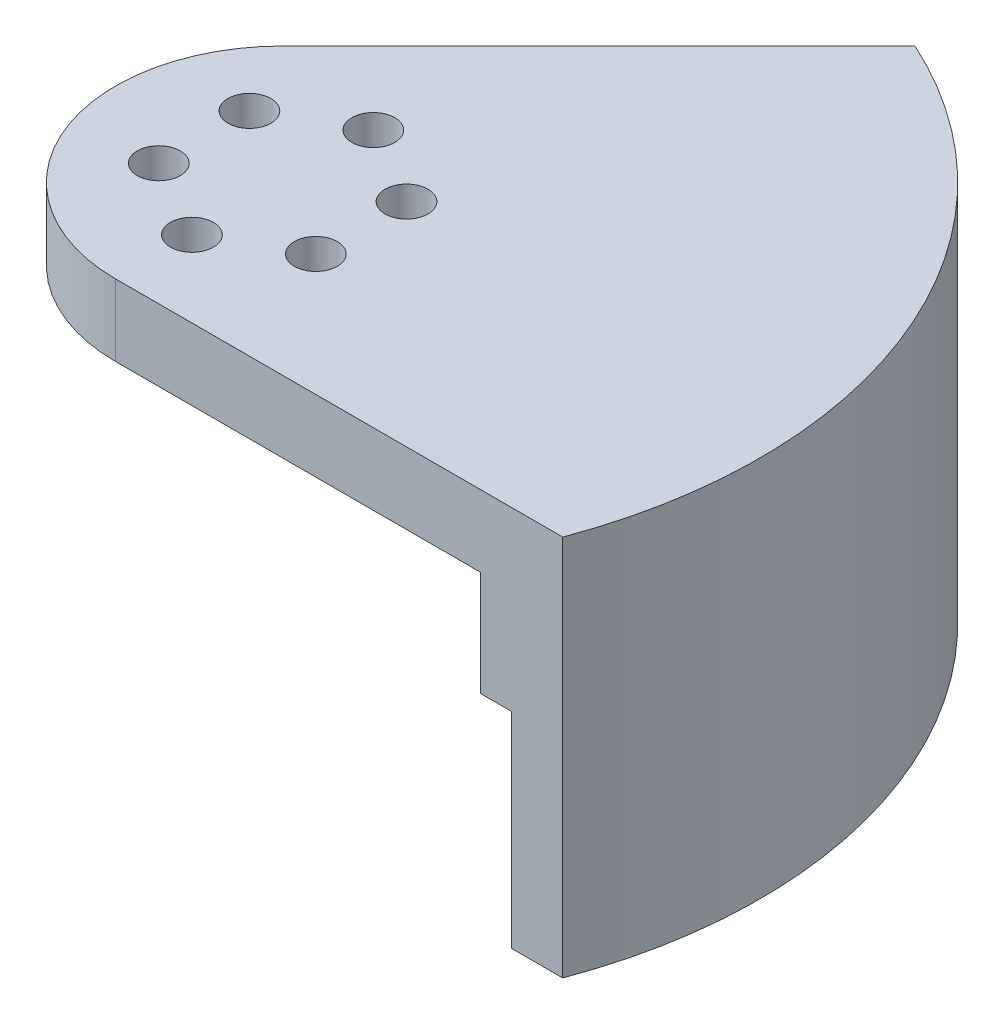
ISO-10303-21;
HEADER;
FILE_DESCRIPTION(('STEP AP214'),'2;1');
FILE_NAME('part.step','',(''),(''),'','','');
FILE_SCHEMA(('AUTOMOTIVE_DESIGN { 1 0 10303 214 1 1 1 1 }'));
ENDSEC;
DATA;
#1=APPLICATION_CONTEXT('core data for automotive mechanical design processes');
#2=APPLICATION_PROTOCOL_DEFINITION('international standard','automotive_design',2000,#1);
#3=PRODUCT_CONTEXT('',#1,'mechanical');
#4=PRODUCT('Part','Part','',(#3));
#5=PRODUCT_RELATED_PRODUCT_CATEGORY('part','',(#4));
#6=PRODUCT_DEFINITION_FORMATION('','',#4);
#7=PRODUCT_DEFINITION_CONTEXT('part definition',#1,'design');
#8=PRODUCT_DEFINITION('design','',#6,#7);
#9=PRODUCT_DEFINITION_SHAPE('','',#8);
#10=(LENGTH_UNIT() NAMED_UNIT(*) SI_UNIT(.MILLI.,.METRE.));
#11=(NAMED_UNIT(*) PLANE_ANGLE_UNIT() SI_UNIT($,.RADIAN.));
#12=(NAMED_UNIT(*) SI_UNIT($,.STERADIAN.) SOLID_ANGLE_UNIT());
#13=UNCERTAINTY_MEASURE_WITH_UNIT(LENGTH_MEASURE(1.E-05),#10,'distance_accuracy_value','');
#14=(GEOMETRIC_REPRESENTATION_CONTEXT(3) GLOBAL_UNCERTAINTY_ASSIGNED_CONTEXT((#13)) GLOBAL_UNIT_ASSIGNED_CONTEXT((#10,
#11,#12)) REPRESENTATION_CONTEXT('',''));
#15=CARTESIAN_POINT('',(0.,0.,0.));
#16=DIRECTION('',(0.,0.,1.));
#17=DIRECTION('',(1.,0.,0.));
#18=AXIS2_PLACEMENT_3D('',#15,#16,#17);
#19=CARTESIAN_POINT('',(0.,0.,0.));
#20=DIRECTION('',(0.,1.,0.));
#21=DIRECTION('',(0.,0.,1.));
#22=AXIS2_PLACEMENT_3D('',#19,#20,#21);
#23=PLANE('',#22);
#24=CARTESIAN_POINT('',(16.4544826719043,0.,-9.5));
#25=DIRECTION('',(0.,1.,0.));
#26=DIRECTION('',(0.,0.,1.));
#27=AXIS2_PLACEMENT_3D('',#24,#25,#26);
#28=CIRCLE('',#27,2.75);
#29=CARTESIAN_POINT('',(16.4544826719043,0.,-6.75));
#30=VERTEX_POINT('',#29);
#31=EDGE_CURVE('E269',#30,#30,#28,.T.);
#32=ORIENTED_EDGE('',*,*,#31,.T.);
#33=EDGE_LOOP('',(#32));
#34=FACE_BOUND('',#33,.T.);
#35=CARTESIAN_POINT('',(16.4544826719043,0.,9.5));
#36=DIRECTION('',(0.,1.,0.));
#37=DIRECTION('',(0.,0.,1.));
#38=AXIS2_PLACEMENT_3D('',#35,#36,#37);
#39=CIRCLE('',#38,2.75);
#40=CARTESIAN_POINT('',(16.4544826719043,0.,12.25));
#41=VERTEX_POINT('',#40);
#42=EDGE_CURVE('E277',#41,#41,#39,.T.);
#43=ORIENTED_EDGE('',*,*,#42,.T.);
#44=EDGE_LOOP('',(#43));
#45=FACE_BOUND('',#44,.T.);
#46=CARTESIAN_POINT('',(0.,0.,19.));
#47=DIRECTION('',(0.,1.,0.));
#48=DIRECTION('',(0.,0.,1.));
#49=AXIS2_PLACEMENT_3D('',#46,#47,#48);
#50=CIRCLE('',#49,2.75);
#51=CARTESIAN_POINT('',(0.,0.,21.75));
#52=VERTEX_POINT('',#51);
#53=EDGE_CURVE('E285',#52,#52,#50,.T.);
#54=ORIENTED_EDGE('',*,*,#53,.T.);
#55=EDGE_LOOP('',(#54));
#56=FACE_BOUND('',#55,.T.);
#57=CARTESIAN_POINT('',(-16.4544826719043,0.,9.50000000000001));
#58=DIRECTION('',(0.,1.,0.));
#59=DIRECTION('',(0.,0.,1.));
#60=AXIS2_PLACEMENT_3D('',#57,#58,#59);
#61=CIRCLE('',#60,2.75);
#62=CARTESIAN_POINT('',(-16.4544826719043,0.,12.25));
#63=VERTEX_POINT('',#62);
#64=EDGE_CURVE('E262',#63,#63,#61,.T.);
#65=ORIENTED_EDGE('',*,*,#64,.T.);
#66=EDGE_LOOP('',(#65));
#67=FACE_BOUND('',#66,.T.);
#68=CARTESIAN_POINT('',(-16.4544826719043,0.,-9.50000000000001));
#69=DIRECTION('',(0.,1.,0.));
#70=DIRECTION('',(0.,0.,1.));
#71=AXIS2_PLACEMENT_3D('',#68,#69,#70);
#72=CIRCLE('',#71,2.75);
#73=CARTESIAN_POINT('',(-16.4544826719043,0.,-6.75000000000001));
#74=VERTEX_POINT('',#73);
#75=EDGE_CURVE('E247',#74,#74,#72,.T.);
#76=ORIENTED_EDGE('',*,*,#75,.T.);
#77=EDGE_LOOP('',(#76));
#78=FACE_BOUND('',#77,.T.);
#79=CARTESIAN_POINT('',(0.,0.,-19.));
#80=DIRECTION('',(0.,1.,0.));
#81=DIRECTION('',(0.,0.,1.));
#82=AXIS2_PLACEMENT_3D('',#79,#80,#81);
#83=CIRCLE('',#82,2.75);
#84=CARTESIAN_POINT('',(0.,0.,-16.25));
#85=VERTEX_POINT('',#84);
#86=EDGE_CURVE('E248',#85,#85,#83,.T.);
#87=ORIENTED_EDGE('',*,*,#86,.T.);
#88=EDGE_LOOP('',(#87));
#89=FACE_BOUND('',#88,.T.);
#90=DIRECTION('',(-0.707106781186548,0.,-0.707106781186547));
#91=VECTOR('',#90,1.);
#92=CARTESIAN_POINT('',(34.5977022230104,0.,-73.4885751882705));
#93=LINE('',#92,#91);
#94=CARTESIAN_POINT('',(34.5977022230104,0.,-73.4885751882705));
#95=VERTEX_POINT('',#94);
#96=CARTESIAN_POINT('',(29.2944013641113,0.,-78.7918760471696));
#97=VERTEX_POINT('',#96);
#98=EDGE_CURVE('E453',#95,#97,#93,.T.);
#99=ORIENTED_EDGE('',*,*,#98,.F.);
#100=CARTESIAN_POINT('',(37.4261293477566,0.,-76.3170023130167));
#101=DIRECTION('',(0.,-1.,0.));
#102=DIRECTION('',(0.,0.,-1.));
#103=AXIS2_PLACEMENT_3D('',#100,#101,#102);
#104=CIRCLE('',#103,4.);
#105=CARTESIAN_POINT('',(40.2545564725027,0.,-73.4885751882705));
#106=VERTEX_POINT('',#105);
#107=EDGE_CURVE('E172',#106,#95,#104,.T.);
#108=ORIENTED_EDGE('',*,*,#107,.F.);
#109=DIRECTION('',(-0.707106781186549,0.,0.707106781186546));
#110=VECTOR('',#109,1.);
#111=CARTESIAN_POINT('',(40.2545564725027,0.,-73.4885751882705));
#112=LINE('',#111,#110);
#113=CARTESIAN_POINT('',(44.8148634769891,0.,-78.0488821927568));
#114=VERTEX_POINT('',#113);
#115=EDGE_CURVE('E168',#114,#106,#112,.T.);
#116=ORIENTED_EDGE('',*,*,#115,.F.);
#117=CARTESIAN_POINT('',(0.,0.,0.));
#118=DIRECTION('',(0.,1.,0.));
#119=DIRECTION('',(0.,0.,1.));
#120=AXIS2_PLACEMENT_3D('',#117,#118,#119);
#121=CIRCLE('',#120,90.);
#122=CARTESIAN_POINT('',(86.8777877250566,0.,23.5));
#123=VERTEX_POINT('',#122);
#124=EDGE_CURVE('E175',#123,#114,#121,.T.);
#125=ORIENTED_EDGE('',*,*,#124,.F.);
#126=DIRECTION('',(1.,0.,0.));
#127=VECTOR('',#126,1.);
#128=CARTESIAN_POINT('',(80.4285397107271,0.,23.5));
#129=LINE('',#128,#127);
#130=CARTESIAN_POINT('',(80.4285397107271,0.,23.5));
#131=VERTEX_POINT('',#130);
#132=EDGE_CURVE('E203',#131,#123,#129,.T.);
#133=ORIENTED_EDGE('',*,*,#132,.F.);
#134=CARTESIAN_POINT('',(80.4285397107271,0.,27.5));
#135=DIRECTION('',(0.,-1.,0.));
#136=DIRECTION('',(0.,0.,-1.));
#137=AXIS2_PLACEMENT_3D('',#134,#135,#136);
#138=CIRCLE('',#137,4.);
#139=CARTESIAN_POINT('',(76.4285397107271,0.,27.5));
#140=VERTEX_POINT('',#139);
#141=EDGE_CURVE('E207',#140,#131,#138,.T.);
#142=ORIENTED_EDGE('',*,*,#141,.F.);
#143=DIRECTION('',(0.,0.,-1.));
#144=VECTOR('',#143,1.);
#145=CARTESIAN_POINT('',(76.4285397107271,0.,27.5));
#146=LINE('',#145,#144);
#147=CARTESIAN_POINT('',(76.4285397107271,0.,35.));
#148=VERTEX_POINT('',#147);
#149=EDGE_CURVE('E200',#148,#140,#146,.T.);
#150=ORIENTED_EDGE('',*,*,#149,.F.);
#151=DIRECTION('',(1.,0.,0.));
#152=VECTOR('',#151,1.);
#153=CARTESIAN_POINT('',(0.,0.,35.));
#154=LINE('',#153,#152);
#155=CARTESIAN_POINT('',(0.,0.,35.));
#156=VERTEX_POINT('',#155);
#157=EDGE_CURVE('E361',#156,#148,#154,.T.);
#158=ORIENTED_EDGE('',*,*,#157,.F.);
#159=CARTESIAN_POINT('',(0.,0.,0.));
#160=DIRECTION('',(0.,1.,0.));
#161=DIRECTION('',(0.,0.,1.));
#162=AXIS2_PLACEMENT_3D('',#159,#160,#161);
#163=CIRCLE('',#162,35.);
#164=CARTESIAN_POINT('',(-24.7487373415292,0.,-24.7487373415291));
#165=VERTEX_POINT('',#164);
#166=EDGE_CURVE('E349',#165,#156,#163,.T.);
#167=ORIENTED_EDGE('',*,*,#166,.F.);
#168=DIRECTION('',(0.707106781186546,0.,-0.707106781186549));
#169=VECTOR('',#168,1.);
#170=CARTESIAN_POINT('',(-24.7487373415292,0.,-24.7487373415291));
#171=LINE('',#170,#169);
#172=EDGE_CURVE('E305',#165,#97,#171,.T.);
#173=ORIENTED_EDGE('',*,*,#172,.T.);
#174=EDGE_LOOP('',(#99,#108,#116,#125,#133,#142,#150,#158,#167,#173));
#175=FACE_BOUND('',#174,.T.);
#176=ADVANCED_FACE('F47',(#34,#45,#56,#67,#78,#89,#175),#23,.F.);
#177=CARTESIAN_POINT('',(0.,-65.,0.));
#178=DIRECTION('',(0.,1.,0.));
#179=DIRECTION('',(0.,0.,1.));
#180=AXIS2_PLACEMENT_3D('',#177,#178,#179);
#181=CYLINDRICAL_SURFACE('',#180,90.);
#182=DIRECTION('',(0.,1.,0.));
#183=VECTOR('',#182,1.);
#184=CARTESIAN_POINT('',(44.8148634769891,-22.,-78.0488821927568));
#185=LINE('',#184,#183);
#186=CARTESIAN_POINT('',(44.8148634769891,-22.,-78.0488821927568));
#187=VERTEX_POINT('',#186);
#188=EDGE_CURVE('E182',#187,#114,#185,.T.);
#189=ORIENTED_EDGE('',*,*,#188,.F.);
#190=CARTESIAN_POINT('',(0.,-22.,0.));
#191=DIRECTION('',(0.,-1.,0.));
#192=DIRECTION('',(0.,0.,-1.));
#193=AXIS2_PLACEMENT_3D('',#190,#191,#192);
#194=CIRCLE('',#193,90.);
#195=CARTESIAN_POINT('',(33.8814596562637,-22.,-83.378934339322));
#196=VERTEX_POINT('',#195);
#197=EDGE_CURVE('E442',#196,#187,#194,.T.);
#198=ORIENTED_EDGE('',*,*,#197,.F.);
#199=DIRECTION('',(0.,1.,0.));
#200=VECTOR('',#199,1.);
#201=CARTESIAN_POINT('',(33.8814596562637,-65.,-83.378934339322));
#202=LINE('',#201,#200);
#203=CARTESIAN_POINT('',(33.8814596562637,-65.,-83.378934339322));
#204=VERTEX_POINT('',#203);
#205=EDGE_CURVE('E243',#204,#196,#202,.T.);
#206=ORIENTED_EDGE('',*,*,#205,.F.);
#207=CARTESIAN_POINT('',(0.,-65.,0.));
#208=DIRECTION('',(0.,1.,0.));
#209=DIRECTION('',(0.,0.,1.));
#210=AXIS2_PLACEMENT_3D('',#207,#208,#209);
#211=CIRCLE('',#210,90.);
#212=CARTESIAN_POINT('',(82.915619758885,-65.,35.));
#213=VERTEX_POINT('',#212);
#214=EDGE_CURVE('E180',#213,#204,#211,.T.);
#215=ORIENTED_EDGE('',*,*,#214,.F.);
#216=DIRECTION('',(0.,1.,0.));
#217=VECTOR('',#216,1.);
#218=CARTESIAN_POINT('',(82.915619758885,-65.,35.));
#219=LINE('',#218,#217);
#220=CARTESIAN_POINT('',(82.915619758885,-22.,35.));
#221=VERTEX_POINT('',#220);
#222=EDGE_CURVE('E238',#213,#221,#219,.T.);
#223=ORIENTED_EDGE('',*,*,#222,.T.);
#224=CARTESIAN_POINT('',(0.,-22.,0.));
#225=DIRECTION('',(0.,-1.,0.));
#226=DIRECTION('',(0.,0.,-1.));
#227=AXIS2_PLACEMENT_3D('',#224,#225,#226);
#228=CIRCLE('',#227,90.);
#229=CARTESIAN_POINT('',(86.8777877250566,-22.,23.5));
#230=VERTEX_POINT('',#229);
#231=EDGE_CURVE('E216',#230,#221,#228,.T.);
#232=ORIENTED_EDGE('',*,*,#231,.F.);
#233=DIRECTION('',(0.,1.,0.));
#234=VECTOR('',#233,1.);
#235=CARTESIAN_POINT('',(86.8777877250566,-22.,23.5));
#236=LINE('',#235,#234);
#237=EDGE_CURVE('E65',#230,#123,#236,.T.);
#238=ORIENTED_EDGE('',*,*,#237,.T.);
#239=ORIENTED_EDGE('',*,*,#124,.T.);
#240=EDGE_LOOP('',(#189,#198,#206,#215,#223,#232,#238,#239));
#241=FACE_BOUND('',#240,.T.);
#242=ADVANCED_FACE('F402',(#241),#181,.F.);
#243=CARTESIAN_POINT('',(-24.7487373415292,15.,-24.7487373415291));
#244=DIRECTION('',(-0.707106781186549,0.,-0.707106781186546));
#245=DIRECTION('',(-0.707106781186546,0.,0.707106781186549));
#246=AXIS2_PLACEMENT_3D('',#243,#244,#245);
#247=PLANE('',#246);
#248=ORIENTED_EDGE('',*,*,#172,.F.);
#249=DIRECTION('',(0.,-1.,0.));
#250=VECTOR('',#249,1.);
#251=CARTESIAN_POINT('',(-24.7487373415292,15.,-24.7487373415291));
#252=LINE('',#251,#250);
#253=CARTESIAN_POINT('',(-24.7487373415292,15.,-24.7487373415291));
#254=VERTEX_POINT('',#253);
#255=EDGE_CURVE('E12',#254,#165,#252,.T.);
#256=ORIENTED_EDGE('',*,*,#255,.F.);
#257=DIRECTION('',(0.707106781186546,0.,-0.707106781186549));
#258=VECTOR('',#257,1.);
#259=CARTESIAN_POINT('',(-24.7487373415292,15.,-24.7487373415291));
#260=LINE('',#259,#258);
#261=CARTESIAN_POINT('',(41.4894691559295,15.,-90.9869438389881));
#262=VERTEX_POINT('',#261);
#263=EDGE_CURVE('E344',#254,#262,#260,.T.);
#264=ORIENTED_EDGE('',*,*,#263,.T.);
#265=DIRECTION('',(0.,-1.,0.));
#266=VECTOR('',#265,1.);
#267=CARTESIAN_POINT('',(41.4894691559295,15.,-90.9869438389881));
#268=LINE('',#267,#266);
#269=CARTESIAN_POINT('',(41.4894691559297,-65.,-90.986943838988));
#270=VERTEX_POINT('',#269);
#271=EDGE_CURVE('E51',#262,#270,#268,.T.);
#272=ORIENTED_EDGE('',*,*,#271,.T.);
#273=DIRECTION('',(0.707106781186546,0.,-0.707106781186548));
#274=VECTOR('',#273,1.);
#275=CARTESIAN_POINT('',(41.4894691559297,-65.,-90.986943838988));
#276=LINE('',#275,#274);
#277=EDGE_CURVE('E228',#204,#270,#276,.T.);
#278=ORIENTED_EDGE('',*,*,#277,.F.);
#279=ORIENTED_EDGE('',*,*,#205,.T.);
#280=DIRECTION('',(0.707106781186548,0.,-0.707106781186547));
#281=VECTOR('',#280,1.);
#282=CARTESIAN_POINT('',(29.2944013641113,-22.,-78.7918760471696));
#283=LINE('',#282,#281);
#284=CARTESIAN_POINT('',(29.2944013641113,-22.,-78.7918760471696));
#285=VERTEX_POINT('',#284);
#286=EDGE_CURVE('E73',#285,#196,#283,.T.);
#287=ORIENTED_EDGE('',*,*,#286,.F.);
#288=DIRECTION('',(0.,1.,0.));
#289=VECTOR('',#288,1.);
#290=CARTESIAN_POINT('',(29.2944013641113,-22.,-78.7918760471696));
#291=LINE('',#290,#289);
#292=EDGE_CURVE('E156',#285,#97,#291,.T.);
#293=ORIENTED_EDGE('',*,*,#292,.T.);
#294=EDGE_LOOP('',(#248,#256,#264,#272,#278,#279,#287,#293));
#295=FACE_BOUND('',#294,.T.);
#296=ADVANCED_FACE('F49',(#295),#247,.T.);
#297=CARTESIAN_POINT('',(0.,15.,0.));
#298=DIRECTION('',(0.,-1.,0.));
#299=DIRECTION('',(0.,0.,-1.));
#300=AXIS2_PLACEMENT_3D('',#297,#298,#299);
#301=CYLINDRICAL_SURFACE('',#300,35.);
#302=ORIENTED_EDGE('',*,*,#166,.T.);
#303=DIRECTION('',(0.,-1.,0.));
#304=VECTOR('',#303,1.);
#305=CARTESIAN_POINT('',(0.,15.,35.));
#306=LINE('',#305,#304);
#307=CARTESIAN_POINT('',(0.,15.,35.));
#308=VERTEX_POINT('',#307);
#309=EDGE_CURVE('E57',#308,#156,#306,.T.);
#310=ORIENTED_EDGE('',*,*,#309,.F.);
#311=CARTESIAN_POINT('',(0.,15.,0.));
#312=DIRECTION('',(0.,1.,0.));
#313=DIRECTION('',(0.,0.,1.));
#314=AXIS2_PLACEMENT_3D('',#311,#312,#313);
#315=CIRCLE('',#314,35.);
#316=EDGE_CURVE('E355',#254,#308,#315,.T.);
#317=ORIENTED_EDGE('',*,*,#316,.F.);
#318=ORIENTED_EDGE('',*,*,#255,.T.);
#319=EDGE_LOOP('',(#302,#310,#317,#318));
#320=FACE_BOUND('',#319,.T.);
#321=ADVANCED_FACE('F398',(#320),#301,.T.);
#322=CARTESIAN_POINT('',(0.,15.,35.));
#323=DIRECTION('',(0.,0.,-1.));
#324=DIRECTION('',(-1.,0.,0.));
#325=AXIS2_PLACEMENT_3D('',#322,#323,#324);
#326=PLANE('',#325);
#327=ORIENTED_EDGE('',*,*,#157,.T.);
#328=DIRECTION('',(0.,1.,0.));
#329=VECTOR('',#328,1.);
#330=CARTESIAN_POINT('',(76.4285397107271,-22.,35.));
#331=LINE('',#330,#329);
#332=CARTESIAN_POINT('',(76.4285397107271,-22.,35.));
#333=VERTEX_POINT('',#332);
#334=EDGE_CURVE('E192',#333,#148,#331,.T.);
#335=ORIENTED_EDGE('',*,*,#334,.F.);
#336=DIRECTION('',(-1.,0.,0.));
#337=VECTOR('',#336,1.);
#338=CARTESIAN_POINT('',(76.4285397107271,-22.,35.));
#339=LINE('',#338,#337);
#340=EDGE_CURVE('E213',#221,#333,#339,.T.);
#341=ORIENTED_EDGE('',*,*,#340,.F.);
#342=ORIENTED_EDGE('',*,*,#222,.F.);
#343=DIRECTION('',(-1.,0.,0.));
#344=VECTOR('',#343,1.);
#345=CARTESIAN_POINT('',(93.674969975976,-65.,35.));
#346=LINE('',#345,#344);
#347=CARTESIAN_POINT('',(93.674969975976,-65.,35.));
#348=VERTEX_POINT('',#347);
#349=EDGE_CURVE('E236',#348,#213,#346,.T.);
#350=ORIENTED_EDGE('',*,*,#349,.F.);
#351=DIRECTION('',(0.,-1.,0.));
#352=VECTOR('',#351,1.);
#353=CARTESIAN_POINT('',(93.674969975976,15.,35.));
#354=LINE('',#353,#352);
#355=CARTESIAN_POINT('',(93.674969975976,15.,35.));
#356=VERTEX_POINT('',#355);
#357=EDGE_CURVE('E369',#356,#348,#354,.T.);
#358=ORIENTED_EDGE('',*,*,#357,.F.);
#359=DIRECTION('',(1.,0.,0.));
#360=VECTOR('',#359,1.);
#361=CARTESIAN_POINT('',(0.,15.,35.));
#362=LINE('',#361,#360);
#363=EDGE_CURVE('E352',#308,#356,#362,.T.);
#364=ORIENTED_EDGE('',*,*,#363,.F.);
#365=ORIENTED_EDGE('',*,*,#309,.T.);
#366=EDGE_LOOP('',(#327,#335,#341,#342,#350,#358,#364,#365));
#367=FACE_BOUND('',#366,.T.);
#368=ADVANCED_FACE('F388',(#367),#326,.F.);
#369=CARTESIAN_POINT('',(0.,15.,0.));
#370=DIRECTION('',(0.,-1.,0.));
#371=DIRECTION('',(0.,0.,-1.));
#372=AXIS2_PLACEMENT_3D('',#369,#370,#371);
#373=CYLINDRICAL_SURFACE('',#372,100.);
#374=ORIENTED_EDGE('',*,*,#357,.T.);
#375=CARTESIAN_POINT('',(0.,-65.,0.));
#376=DIRECTION('',(0.,-1.,0.));
#377=DIRECTION('',(0.,0.,1.));
#378=AXIS2_PLACEMENT_3D('',#375,#376,#377);
#379=CIRCLE('',#378,100.);
#380=EDGE_CURVE('E232',#270,#348,#379,.T.);
#381=ORIENTED_EDGE('',*,*,#380,.F.);
#382=ORIENTED_EDGE('',*,*,#271,.F.);
#383=CARTESIAN_POINT('',(0.,15.,0.));
#384=DIRECTION('',(0.,1.,0.));
#385=DIRECTION('',(0.,0.,1.));
#386=AXIS2_PLACEMENT_3D('',#383,#384,#385);
#387=CIRCLE('',#386,100.);
#388=EDGE_CURVE('E348',#356,#262,#387,.T.);
#389=ORIENTED_EDGE('',*,*,#388,.F.);
#390=EDGE_LOOP('',(#374,#381,#382,#389));
#391=FACE_BOUND('',#390,.T.);
#392=ADVANCED_FACE('F385',(#391),#373,.T.);
#393=CARTESIAN_POINT('',(0.,15.,0.));
#394=DIRECTION('',(0.,1.,0.));
#395=DIRECTION('',(0.,0.,1.));
#396=AXIS2_PLACEMENT_3D('',#393,#394,#395);
#397=PLANE('',#396);
#398=CARTESIAN_POINT('',(0.,15.,-19.));
#399=DIRECTION('',(0.,1.,0.));
#400=DIRECTION('',(0.,0.,1.));
#401=AXIS2_PLACEMENT_3D('',#398,#399,#400);
#402=CIRCLE('',#401,4.5);
#403=CARTESIAN_POINT('',(0.,15.,-14.5));
#404=VERTEX_POINT('',#403);
#405=EDGE_CURVE('E296',#404,#404,#402,.T.);
#406=ORIENTED_EDGE('',*,*,#405,.F.);
#407=EDGE_LOOP('',(#406));
#408=FACE_BOUND('',#407,.T.);
#409=CARTESIAN_POINT('',(-16.4544826719043,15.,-9.50000000000001));
#410=DIRECTION('',(0.,1.,0.));
#411=DIRECTION('',(0.,0.,1.));
#412=AXIS2_PLACEMENT_3D('',#409,#410,#411);
#413=CIRCLE('',#412,4.5);
#414=CARTESIAN_POINT('',(-16.4544826719043,15.,-5.));
#415=VERTEX_POINT('',#414);
#416=EDGE_CURVE('E309',#415,#415,#413,.T.);
#417=ORIENTED_EDGE('',*,*,#416,.F.);
#418=EDGE_LOOP('',(#417));
#419=FACE_BOUND('',#418,.T.);
#420=CARTESIAN_POINT('',(-16.4544826719043,15.,9.50000000000001));
#421=DIRECTION('',(0.,1.,0.));
#422=DIRECTION('',(0.,0.,1.));
#423=AXIS2_PLACEMENT_3D('',#420,#421,#422);
#424=CIRCLE('',#423,4.5);
#425=CARTESIAN_POINT('',(-16.4544826719043,15.,14.));
#426=VERTEX_POINT('',#425);
#427=EDGE_CURVE('E334',#426,#426,#424,.T.);
#428=ORIENTED_EDGE('',*,*,#427,.F.);
#429=EDGE_LOOP('',(#428));
#430=FACE_BOUND('',#429,.T.);
#431=CARTESIAN_POINT('',(0.,15.,19.));
#432=DIRECTION('',(0.,1.,0.));
#433=DIRECTION('',(0.,0.,1.));
#434=AXIS2_PLACEMENT_3D('',#431,#432,#433);
#435=CIRCLE('',#434,4.5);
#436=CARTESIAN_POINT('',(0.,15.,23.5));
#437=VERTEX_POINT('',#436);
#438=EDGE_CURVE('E326',#437,#437,#435,.T.);
#439=ORIENTED_EDGE('',*,*,#438,.F.);
#440=EDGE_LOOP('',(#439));
#441=FACE_BOUND('',#440,.T.);
#442=CARTESIAN_POINT('',(16.4544826719043,15.,9.5));
#443=DIRECTION('',(0.,1.,0.));
#444=DIRECTION('',(0.,0.,1.));
#445=AXIS2_PLACEMENT_3D('',#442,#443,#444);
#446=CIRCLE('',#445,4.5);
#447=CARTESIAN_POINT('',(16.4544826719043,15.,14.));
#448=VERTEX_POINT('',#447);
#449=EDGE_CURVE('E318',#448,#448,#446,.T.);
#450=ORIENTED_EDGE('',*,*,#449,.F.);
#451=EDGE_LOOP('',(#450));
#452=FACE_BOUND('',#451,.T.);
#453=CARTESIAN_POINT('',(16.4544826719043,15.,-9.5));
#454=DIRECTION('',(0.,1.,0.));
#455=DIRECTION('',(0.,0.,1.));
#456=AXIS2_PLACEMENT_3D('',#453,#454,#455);
#457=CIRCLE('',#456,4.5);
#458=CARTESIAN_POINT('',(16.4544826719043,15.,-5.));
#459=VERTEX_POINT('',#458);
#460=EDGE_CURVE('E301',#459,#459,#457,.T.);
#461=ORIENTED_EDGE('',*,*,#460,.F.);
#462=EDGE_LOOP('',(#461));
#463=FACE_BOUND('',#462,.T.);
#464=ORIENTED_EDGE('',*,*,#263,.F.);
#465=ORIENTED_EDGE('',*,*,#316,.T.);
#466=ORIENTED_EDGE('',*,*,#363,.T.);
#467=ORIENTED_EDGE('',*,*,#388,.T.);
#468=EDGE_LOOP('',(#464,#465,#466,#467));
#469=FACE_BOUND('',#468,.T.);
#470=ADVANCED_FACE('F387',(#408,#419,#430,#441,#452,#463,#469),#397,.T.);
#471=CARTESIAN_POINT('',(16.4544826719043,-12.7279220613579,-9.5));
#472=DIRECTION('',(0.,1.,0.));
#473=DIRECTION('',(0.,0.,1.));
#474=AXIS2_PLACEMENT_3D('',#471,#472,#473);
#475=CYLINDRICAL_SURFACE('',#474,4.5);
#476=CARTESIAN_POINT('',(16.4544826719043,6.,-9.5));
#477=DIRECTION('',(0.,1.,0.));
#478=DIRECTION('',(0.,0.,1.));
#479=AXIS2_PLACEMENT_3D('',#476,#477,#478);
#480=CIRCLE('',#479,4.5);
#481=CARTESIAN_POINT('',(16.4544826719043,6.,-5.));
#482=VERTEX_POINT('',#481);
#483=EDGE_CURVE('E314',#482,#482,#480,.F.);
#484=ORIENTED_EDGE('',*,*,#483,.T.);
#485=EDGE_LOOP('',(#484));
#486=FACE_BOUND('',#485,.T.);
#487=ORIENTED_EDGE('',*,*,#460,.T.);
#488=EDGE_LOOP('',(#487));
#489=FACE_BOUND('',#488,.T.);
#490=ADVANCED_FACE('F394',(#486,#489),#475,.F.);
#491=CARTESIAN_POINT('',(0.,6.,0.));
#492=DIRECTION('',(0.,1.,0.));
#493=DIRECTION('',(0.,0.,1.));
#494=AXIS2_PLACEMENT_3D('',#491,#492,#493);
#495=PLANE('',#494);
#496=CARTESIAN_POINT('',(16.4544826719043,6.,-9.5));
#497=DIRECTION('',(0.,1.,0.));
#498=DIRECTION('',(0.,0.,1.));
#499=AXIS2_PLACEMENT_3D('',#496,#497,#498);
#500=CIRCLE('',#499,2.75);
#501=CARTESIAN_POINT('',(16.4544826719043,6.,-6.75));
#502=VERTEX_POINT('',#501);
#503=EDGE_CURVE('E257',#502,#502,#500,.T.);
#504=ORIENTED_EDGE('',*,*,#503,.F.);
#505=EDGE_LOOP('',(#504));
#506=FACE_BOUND('',#505,.T.);
#507=ORIENTED_EDGE('',*,*,#483,.F.);
#508=EDGE_LOOP('',(#507));
#509=FACE_BOUND('',#508,.T.);
#510=ADVANCED_FACE('F522',(#506,#509),#495,.T.);
#511=CARTESIAN_POINT('',(16.4544826719043,-12.7279220613579,9.5));
#512=DIRECTION('',(0.,1.,0.));
#513=DIRECTION('',(0.,0.,1.));
#514=AXIS2_PLACEMENT_3D('',#511,#512,#513);
#515=CYLINDRICAL_SURFACE('',#514,4.5);
#516=CARTESIAN_POINT('',(16.4544826719043,6.,9.5));
#517=DIRECTION('',(0.,1.,0.));
#518=DIRECTION('',(0.,0.,1.));
#519=AXIS2_PLACEMENT_3D('',#516,#517,#518);
#520=CIRCLE('',#519,4.5);
#521=CARTESIAN_POINT('',(16.4544826719043,6.,14.));
#522=VERTEX_POINT('',#521);
#523=EDGE_CURVE('E322',#522,#522,#520,.F.);
#524=ORIENTED_EDGE('',*,*,#523,.T.);
#525=EDGE_LOOP('',(#524));
#526=FACE_BOUND('',#525,.T.);
#527=ORIENTED_EDGE('',*,*,#449,.T.);
#528=EDGE_LOOP('',(#527));
#529=FACE_BOUND('',#528,.T.);
#530=ADVANCED_FACE('F526',(#526,#529),#515,.F.);
#531=CARTESIAN_POINT('',(0.,6.,0.));
#532=DIRECTION('',(0.,1.,0.));
#533=DIRECTION('',(0.,0.,1.));
#534=AXIS2_PLACEMENT_3D('',#531,#532,#533);
#535=PLANE('',#534);
#536=CARTESIAN_POINT('',(16.4544826719043,6.,9.5));
#537=DIRECTION('',(0.,1.,0.));
#538=DIRECTION('',(0.,0.,1.));
#539=AXIS2_PLACEMENT_3D('',#536,#537,#538);
#540=CIRCLE('',#539,2.75);
#541=CARTESIAN_POINT('',(16.4544826719043,6.,12.25));
#542=VERTEX_POINT('',#541);
#543=EDGE_CURVE('E273',#542,#542,#540,.T.);
#544=ORIENTED_EDGE('',*,*,#543,.F.);
#545=EDGE_LOOP('',(#544));
#546=FACE_BOUND('',#545,.T.);
#547=ORIENTED_EDGE('',*,*,#523,.F.);
#548=EDGE_LOOP('',(#547));
#549=FACE_BOUND('',#548,.T.);
#550=ADVANCED_FACE('F530',(#546,#549),#535,.T.);
#551=CARTESIAN_POINT('',(0.,-12.7279220613579,19.));
#552=DIRECTION('',(0.,1.,0.));
#553=DIRECTION('',(0.,0.,1.));
#554=AXIS2_PLACEMENT_3D('',#551,#552,#553);
#555=CYLINDRICAL_SURFACE('',#554,4.5);
#556=CARTESIAN_POINT('',(0.,6.,19.));
#557=DIRECTION('',(0.,1.,0.));
#558=DIRECTION('',(0.,0.,1.));
#559=AXIS2_PLACEMENT_3D('',#556,#557,#558);
#560=CIRCLE('',#559,4.5);
#561=CARTESIAN_POINT('',(0.,6.,23.5));
#562=VERTEX_POINT('',#561);
#563=EDGE_CURVE('E330',#562,#562,#560,.F.);
#564=ORIENTED_EDGE('',*,*,#563,.T.);
#565=EDGE_LOOP('',(#564));
#566=FACE_BOUND('',#565,.T.);
#567=ORIENTED_EDGE('',*,*,#438,.T.);
#568=EDGE_LOOP('',(#567));
#569=FACE_BOUND('',#568,.T.);
#570=ADVANCED_FACE('F534',(#566,#569),#555,.F.);
#571=CARTESIAN_POINT('',(0.,6.,0.));
#572=DIRECTION('',(0.,1.,0.));
#573=DIRECTION('',(0.,0.,1.));
#574=AXIS2_PLACEMENT_3D('',#571,#572,#573);
#575=PLANE('',#574);
#576=CARTESIAN_POINT('',(0.,6.,19.));
#577=DIRECTION('',(0.,1.,0.));
#578=DIRECTION('',(0.,0.,1.));
#579=AXIS2_PLACEMENT_3D('',#576,#577,#578);
#580=CIRCLE('',#579,2.75);
#581=CARTESIAN_POINT('',(0.,6.,21.75));
#582=VERTEX_POINT('',#581);
#583=EDGE_CURVE('E281',#582,#582,#580,.T.);
#584=ORIENTED_EDGE('',*,*,#583,.F.);
#585=EDGE_LOOP('',(#584));
#586=FACE_BOUND('',#585,.T.);
#587=ORIENTED_EDGE('',*,*,#563,.F.);
#588=EDGE_LOOP('',(#587));
#589=FACE_BOUND('',#588,.T.);
#590=ADVANCED_FACE('F538',(#586,#589),#575,.T.);
#591=CARTESIAN_POINT('',(-16.4544826719043,-12.7279220613579,9.50000000000001));
#592=DIRECTION('',(0.,1.,0.));
#593=DIRECTION('',(0.,0.,1.));
#594=AXIS2_PLACEMENT_3D('',#591,#592,#593);
#595=CYLINDRICAL_SURFACE('',#594,4.5);
#596=CARTESIAN_POINT('',(-16.4544826719043,6.,9.50000000000001));
#597=DIRECTION('',(0.,1.,0.));
#598=DIRECTION('',(0.,0.,1.));
#599=AXIS2_PLACEMENT_3D('',#596,#597,#598);
#600=CIRCLE('',#599,4.5);
#601=CARTESIAN_POINT('',(-16.4544826719043,6.,14.));
#602=VERTEX_POINT('',#601);
#603=EDGE_CURVE('E313',#602,#602,#600,.F.);
#604=ORIENTED_EDGE('',*,*,#603,.T.);
#605=EDGE_LOOP('',(#604));
#606=FACE_BOUND('',#605,.T.);
#607=ORIENTED_EDGE('',*,*,#427,.T.);
#608=EDGE_LOOP('',(#607));
#609=FACE_BOUND('',#608,.T.);
#610=ADVANCED_FACE('F542',(#606,#609),#595,.F.);
#611=CARTESIAN_POINT('',(0.,6.,0.));
#612=DIRECTION('',(0.,1.,0.));
#613=DIRECTION('',(0.,0.,1.));
#614=AXIS2_PLACEMENT_3D('',#611,#612,#613);
#615=PLANE('',#614);
#616=CARTESIAN_POINT('',(-16.4544826719043,6.,9.50000000000001));
#617=DIRECTION('',(0.,1.,0.));
#618=DIRECTION('',(0.,0.,1.));
#619=AXIS2_PLACEMENT_3D('',#616,#617,#618);
#620=CIRCLE('',#619,2.75);
#621=CARTESIAN_POINT('',(-16.4544826719043,6.,12.25));
#622=VERTEX_POINT('',#621);
#623=EDGE_CURVE('E289',#622,#622,#620,.T.);
#624=ORIENTED_EDGE('',*,*,#623,.F.);
#625=EDGE_LOOP('',(#624));
#626=FACE_BOUND('',#625,.T.);
#627=ORIENTED_EDGE('',*,*,#603,.F.);
#628=EDGE_LOOP('',(#627));
#629=FACE_BOUND('',#628,.T.);
#630=ADVANCED_FACE('F515',(#626,#629),#615,.T.);
#631=CARTESIAN_POINT('',(-16.4544826719043,-12.7279220613579,-9.50000000000001));
#632=DIRECTION('',(0.,1.,0.));
#633=DIRECTION('',(0.,0.,1.));
#634=AXIS2_PLACEMENT_3D('',#631,#632,#633);
#635=CYLINDRICAL_SURFACE('',#634,4.5);
#636=CARTESIAN_POINT('',(-16.4544826719043,6.,-9.50000000000001));
#637=DIRECTION('',(0.,1.,0.));
#638=DIRECTION('',(0.,0.,1.));
#639=AXIS2_PLACEMENT_3D('',#636,#637,#638);
#640=CIRCLE('',#639,4.5);
#641=CARTESIAN_POINT('',(-16.4544826719043,6.,-5.));
#642=VERTEX_POINT('',#641);
#643=EDGE_CURVE('E252',#642,#642,#640,.F.);
#644=ORIENTED_EDGE('',*,*,#643,.T.);
#645=EDGE_LOOP('',(#644));
#646=FACE_BOUND('',#645,.T.);
#647=ORIENTED_EDGE('',*,*,#416,.T.);
#648=EDGE_LOOP('',(#647));
#649=FACE_BOUND('',#648,.T.);
#650=ADVANCED_FACE('F512',(#646,#649),#635,.F.);
#651=CARTESIAN_POINT('',(0.,6.,0.));
#652=DIRECTION('',(0.,1.,0.));
#653=DIRECTION('',(0.,0.,1.));
#654=AXIS2_PLACEMENT_3D('',#651,#652,#653);
#655=PLANE('',#654);
#656=CARTESIAN_POINT('',(-16.4544826719043,6.,-9.50000000000001));
#657=DIRECTION('',(0.,1.,0.));
#658=DIRECTION('',(0.,0.,1.));
#659=AXIS2_PLACEMENT_3D('',#656,#657,#658);
#660=CIRCLE('',#659,2.75);
#661=CARTESIAN_POINT('',(-16.4544826719043,6.,-6.75000000000001));
#662=VERTEX_POINT('',#661);
#663=EDGE_CURVE('E258',#662,#662,#660,.T.);
#664=ORIENTED_EDGE('',*,*,#663,.F.);
#665=EDGE_LOOP('',(#664));
#666=FACE_BOUND('',#665,.T.);
#667=ORIENTED_EDGE('',*,*,#643,.F.);
#668=EDGE_LOOP('',(#667));
#669=FACE_BOUND('',#668,.T.);
#670=ADVANCED_FACE('F510',(#666,#669),#655,.T.);
#671=CARTESIAN_POINT('',(0.,-12.7279220613579,-19.));
#672=DIRECTION('',(0.,1.,0.));
#673=DIRECTION('',(0.,0.,1.));
#674=AXIS2_PLACEMENT_3D('',#671,#672,#673);
#675=CYLINDRICAL_SURFACE('',#674,4.5);
#676=CARTESIAN_POINT('',(0.,6.,-19.));
#677=DIRECTION('',(0.,1.,0.));
#678=DIRECTION('',(0.,0.,1.));
#679=AXIS2_PLACEMENT_3D('',#676,#677,#678);
#680=CIRCLE('',#679,4.5);
#681=CARTESIAN_POINT('',(0.,6.,-14.5));
#682=VERTEX_POINT('',#681);
#683=EDGE_CURVE('E300',#682,#682,#680,.F.);
#684=ORIENTED_EDGE('',*,*,#683,.T.);
#685=EDGE_LOOP('',(#684));
#686=FACE_BOUND('',#685,.T.);
#687=ORIENTED_EDGE('',*,*,#405,.T.);
#688=EDGE_LOOP('',(#687));
#689=FACE_BOUND('',#688,.T.);
#690=ADVANCED_FACE('F506',(#686,#689),#675,.F.);
#691=CARTESIAN_POINT('',(0.,6.,0.));
#692=DIRECTION('',(0.,1.,0.));
#693=DIRECTION('',(0.,0.,1.));
#694=AXIS2_PLACEMENT_3D('',#691,#692,#693);
#695=PLANE('',#694);
#696=CARTESIAN_POINT('',(0.,6.,-19.));
#697=DIRECTION('',(0.,1.,0.));
#698=DIRECTION('',(0.,0.,1.));
#699=AXIS2_PLACEMENT_3D('',#696,#697,#698);
#700=CIRCLE('',#699,2.75);
#701=CARTESIAN_POINT('',(0.,6.,-16.25));
#702=VERTEX_POINT('',#701);
#703=EDGE_CURVE('E253',#702,#702,#700,.T.);
#704=ORIENTED_EDGE('',*,*,#703,.F.);
#705=EDGE_LOOP('',(#704));
#706=FACE_BOUND('',#705,.T.);
#707=ORIENTED_EDGE('',*,*,#683,.F.);
#708=EDGE_LOOP('',(#707));
#709=FACE_BOUND('',#708,.T.);
#710=ADVANCED_FACE('F492',(#706,#709),#695,.T.);
#711=CARTESIAN_POINT('',(16.4544826719043,0.,-9.5));
#712=DIRECTION('',(0.,1.,0.));
#713=DIRECTION('',(0.,0.,1.));
#714=AXIS2_PLACEMENT_3D('',#711,#712,#713);
#715=CYLINDRICAL_SURFACE('',#714,2.75);
#716=ORIENTED_EDGE('',*,*,#31,.F.);
#717=EDGE_LOOP('',(#716));
#718=FACE_BOUND('',#717,.T.);
#719=ORIENTED_EDGE('',*,*,#503,.T.);
#720=EDGE_LOOP('',(#719));
#721=FACE_BOUND('',#720,.T.);
#722=ADVANCED_FACE('F488',(#718,#721),#715,.F.);
#723=CARTESIAN_POINT('',(16.4544826719043,0.,9.5));
#724=DIRECTION('',(0.,1.,0.));
#725=DIRECTION('',(0.,0.,1.));
#726=AXIS2_PLACEMENT_3D('',#723,#724,#725);
#727=CYLINDRICAL_SURFACE('',#726,2.75);
#728=ORIENTED_EDGE('',*,*,#42,.F.);
#729=EDGE_LOOP('',(#728));
#730=FACE_BOUND('',#729,.T.);
#731=ORIENTED_EDGE('',*,*,#543,.T.);
#732=EDGE_LOOP('',(#731));
#733=FACE_BOUND('',#732,.T.);
#734=ADVANCED_FACE('F491',(#730,#733),#727,.F.);
#735=CARTESIAN_POINT('',(0.,0.,19.));
#736=DIRECTION('',(0.,1.,0.));
#737=DIRECTION('',(0.,0.,1.));
#738=AXIS2_PLACEMENT_3D('',#735,#736,#737);
#739=CYLINDRICAL_SURFACE('',#738,2.75);
#740=ORIENTED_EDGE('',*,*,#53,.F.);
#741=EDGE_LOOP('',(#740));
#742=FACE_BOUND('',#741,.T.);
#743=ORIENTED_EDGE('',*,*,#583,.T.);
#744=EDGE_LOOP('',(#743));
#745=FACE_BOUND('',#744,.T.);
#746=ADVANCED_FACE('F496',(#742,#745),#739,.F.);
#747=CARTESIAN_POINT('',(-16.4544826719043,0.,9.50000000000001));
#748=DIRECTION('',(0.,1.,0.));
#749=DIRECTION('',(0.,0.,1.));
#750=AXIS2_PLACEMENT_3D('',#747,#748,#749);
#751=CYLINDRICAL_SURFACE('',#750,2.75);
#752=ORIENTED_EDGE('',*,*,#64,.F.);
#753=EDGE_LOOP('',(#752));
#754=FACE_BOUND('',#753,.T.);
#755=ORIENTED_EDGE('',*,*,#623,.T.);
#756=EDGE_LOOP('',(#755));
#757=FACE_BOUND('',#756,.T.);
#758=ADVANCED_FACE('F486',(#754,#757),#751,.F.);
#759=CARTESIAN_POINT('',(-16.4544826719043,0.,-9.50000000000001));
#760=DIRECTION('',(0.,1.,0.));
#761=DIRECTION('',(0.,0.,1.));
#762=AXIS2_PLACEMENT_3D('',#759,#760,#761);
#763=CYLINDRICAL_SURFACE('',#762,2.75);
#764=ORIENTED_EDGE('',*,*,#75,.F.);
#765=EDGE_LOOP('',(#764));
#766=FACE_BOUND('',#765,.T.);
#767=ORIENTED_EDGE('',*,*,#663,.T.);
#768=EDGE_LOOP('',(#767));
#769=FACE_BOUND('',#768,.T.);
#770=ADVANCED_FACE('F482',(#766,#769),#763,.F.);
#771=CARTESIAN_POINT('',(0.,0.,-19.));
#772=DIRECTION('',(0.,1.,0.));
#773=DIRECTION('',(0.,0.,1.));
#774=AXIS2_PLACEMENT_3D('',#771,#772,#773);
#775=CYLINDRICAL_SURFACE('',#774,2.75);
#776=ORIENTED_EDGE('',*,*,#86,.F.);
#777=EDGE_LOOP('',(#776));
#778=FACE_BOUND('',#777,.T.);
#779=ORIENTED_EDGE('',*,*,#703,.T.);
#780=EDGE_LOOP('',(#779));
#781=FACE_BOUND('',#780,.T.);
#782=ADVANCED_FACE('F479',(#778,#781),#775,.F.);
#783=CARTESIAN_POINT('',(0.,-65.,0.));
#784=DIRECTION('',(0.,1.,0.));
#785=DIRECTION('',(0.,0.,1.));
#786=AXIS2_PLACEMENT_3D('',#783,#784,#785);
#787=PLANE('',#786);
#788=ORIENTED_EDGE('',*,*,#214,.T.);
#789=ORIENTED_EDGE('',*,*,#277,.T.);
#790=ORIENTED_EDGE('',*,*,#380,.T.);
#791=ORIENTED_EDGE('',*,*,#349,.T.);
#792=EDGE_LOOP('',(#788,#789,#790,#791));
#793=FACE_BOUND('',#792,.T.);
#794=ADVANCED_FACE('F381',(#793),#787,.F.);
#795=CARTESIAN_POINT('',(80.4285397107271,-22.,27.5));
#796=DIRECTION('',(0.,1.,0.));
#797=DIRECTION('',(0.,0.,1.));
#798=AXIS2_PLACEMENT_3D('',#795,#796,#797);
#799=CYLINDRICAL_SURFACE('',#798,4.);
#800=ORIENTED_EDGE('',*,*,#141,.T.);
#801=DIRECTION('',(0.,1.,0.));
#802=VECTOR('',#801,1.);
#803=CARTESIAN_POINT('',(80.4285397107271,-22.,23.5));
#804=LINE('',#803,#802);
#805=CARTESIAN_POINT('',(80.4285397107271,-22.,23.5));
#806=VERTEX_POINT('',#805);
#807=EDGE_CURVE('E186',#806,#131,#804,.T.);
#808=ORIENTED_EDGE('',*,*,#807,.F.);
#809=CARTESIAN_POINT('',(80.4285397107271,-22.,27.5));
#810=DIRECTION('',(0.,-1.,0.));
#811=DIRECTION('',(0.,0.,-1.));
#812=AXIS2_PLACEMENT_3D('',#809,#810,#811);
#813=CIRCLE('',#812,4.);
#814=CARTESIAN_POINT('',(76.4285397107271,-22.,27.5));
#815=VERTEX_POINT('',#814);
#816=EDGE_CURVE('E204',#815,#806,#813,.T.);
#817=ORIENTED_EDGE('',*,*,#816,.F.);
#818=DIRECTION('',(0.,1.,0.));
#819=VECTOR('',#818,1.);
#820=CARTESIAN_POINT('',(76.4285397107271,-22.,27.5));
#821=LINE('',#820,#819);
#822=EDGE_CURVE('E195',#815,#140,#821,.T.);
#823=ORIENTED_EDGE('',*,*,#822,.T.);
#824=EDGE_LOOP('',(#800,#808,#817,#823));
#825=FACE_BOUND('',#824,.T.);
#826=ADVANCED_FACE('F434',(#825),#799,.T.);
#827=CARTESIAN_POINT('',(80.4285397107271,-22.,23.5));
#828=DIRECTION('',(0.,0.,1.));
#829=DIRECTION('',(1.,0.,0.));
#830=AXIS2_PLACEMENT_3D('',#827,#828,#829);
#831=PLANE('',#830);
#832=ORIENTED_EDGE('',*,*,#132,.T.);
#833=ORIENTED_EDGE('',*,*,#237,.F.);
#834=DIRECTION('',(1.,0.,0.));
#835=VECTOR('',#834,1.);
#836=CARTESIAN_POINT('',(80.4285397107271,-22.,23.5));
#837=LINE('',#836,#835);
#838=EDGE_CURVE('E219',#806,#230,#837,.T.);
#839=ORIENTED_EDGE('',*,*,#838,.F.);
#840=ORIENTED_EDGE('',*,*,#807,.T.);
#841=EDGE_LOOP('',(#832,#833,#839,#840));
#842=FACE_BOUND('',#841,.T.);
#843=ADVANCED_FACE('F465',(#842),#831,.F.);
#844=CARTESIAN_POINT('',(76.4285397107271,-22.,27.5));
#845=DIRECTION('',(1.,0.,0.));
#846=DIRECTION('',(0.,0.,-1.));
#847=AXIS2_PLACEMENT_3D('',#844,#845,#846);
#848=PLANE('',#847);
#849=ORIENTED_EDGE('',*,*,#149,.T.);
#850=ORIENTED_EDGE('',*,*,#822,.F.);
#851=DIRECTION('',(0.,0.,-1.));
#852=VECTOR('',#851,1.);
#853=CARTESIAN_POINT('',(76.4285397107271,-22.,27.5));
#854=LINE('',#853,#852);
#855=EDGE_CURVE('E199',#333,#815,#854,.T.);
#856=ORIENTED_EDGE('',*,*,#855,.F.);
#857=ORIENTED_EDGE('',*,*,#334,.T.);
#858=EDGE_LOOP('',(#849,#850,#856,#857));
#859=FACE_BOUND('',#858,.T.);
#860=ADVANCED_FACE('F430',(#859),#848,.F.);
#861=CARTESIAN_POINT('',(80.4285397107271,-22.,27.5));
#862=DIRECTION('',(0.,-1.,0.));
#863=DIRECTION('',(0.,0.,-1.));
#864=AXIS2_PLACEMENT_3D('',#861,#862,#863);
#865=PLANE('',#864);
#866=CARTESIAN_POINT('',(80.4285397107271,-22.,27.5));
#867=DIRECTION('',(0.,-1.,0.));
#868=DIRECTION('',(0.,0.,-1.));
#869=AXIS2_PLACEMENT_3D('',#866,#867,#868);
#870=CIRCLE('',#869,2.50000000000001);
#871=CARTESIAN_POINT('',(80.4285397107271,-22.,25.));
#872=VERTEX_POINT('',#871);
#873=EDGE_CURVE('E754',#872,#872,#870,.T.);
#874=ORIENTED_EDGE('',*,*,#873,.F.);
#875=EDGE_LOOP('',(#874));
#876=FACE_BOUND('',#875,.T.);
#877=ORIENTED_EDGE('',*,*,#816,.T.);
#878=ORIENTED_EDGE('',*,*,#838,.T.);
#879=ORIENTED_EDGE('',*,*,#231,.T.);
#880=ORIENTED_EDGE('',*,*,#340,.T.);
#881=ORIENTED_EDGE('',*,*,#855,.T.);
#882=EDGE_LOOP('',(#877,#878,#879,#880,#881));
#883=FACE_BOUND('',#882,.T.);
#884=ADVANCED_FACE('F437',(#876,#883),#865,.T.);
#885=CARTESIAN_POINT('',(37.4261293477566,-22.,-76.3170023130167));
#886=DIRECTION('',(0.,1.,0.));
#887=DIRECTION('',(0.,0.,1.));
#888=AXIS2_PLACEMENT_3D('',#885,#886,#887);
#889=CYLINDRICAL_SURFACE('',#888,4.);
#890=ORIENTED_EDGE('',*,*,#107,.T.);
#891=DIRECTION('',(0.,1.,0.));
#892=VECTOR('',#891,1.);
#893=CARTESIAN_POINT('',(34.5977022230104,-22.,-73.4885751882705));
#894=LINE('',#893,#892);
#895=CARTESIAN_POINT('',(34.5977022230104,-22.,-73.4885751882705));
#896=VERTEX_POINT('',#895);
#897=EDGE_CURVE('E153',#896,#95,#894,.T.);
#898=ORIENTED_EDGE('',*,*,#897,.F.);
#899=CARTESIAN_POINT('',(37.4261293477566,-22.,-76.3170023130167));
#900=DIRECTION('',(0.,-1.,0.));
#901=DIRECTION('',(0.,0.,-1.));
#902=AXIS2_PLACEMENT_3D('',#899,#900,#901);
#903=CIRCLE('',#902,4.);
#904=CARTESIAN_POINT('',(40.2545564725027,-22.,-73.4885751882705));
#905=VERTEX_POINT('',#904);
#906=EDGE_CURVE('E158',#905,#896,#903,.T.);
#907=ORIENTED_EDGE('',*,*,#906,.F.);
#908=DIRECTION('',(0.,1.,0.));
#909=VECTOR('',#908,1.);
#910=CARTESIAN_POINT('',(40.2545564725027,-22.,-73.4885751882705));
#911=LINE('',#910,#909);
#912=EDGE_CURVE('E450',#905,#106,#911,.T.);
#913=ORIENTED_EDGE('',*,*,#912,.T.);
#914=EDGE_LOOP('',(#890,#898,#907,#913));
#915=FACE_BOUND('',#914,.T.);
#916=ADVANCED_FACE('F170',(#915),#889,.T.);
#917=CARTESIAN_POINT('',(34.5977022230104,-22.,-73.4885751882705));
#918=DIRECTION('',(0.707106781186547,0.,-0.707106781186548));
#919=DIRECTION('',(-0.707106781186548,0.,-0.707106781186547));
#920=AXIS2_PLACEMENT_3D('',#917,#918,#919);
#921=PLANE('',#920);
#922=ORIENTED_EDGE('',*,*,#98,.T.);
#923=ORIENTED_EDGE('',*,*,#292,.F.);
#924=DIRECTION('',(-0.707106781186548,0.,-0.707106781186547));
#925=VECTOR('',#924,1.);
#926=CARTESIAN_POINT('',(34.5977022230104,-22.,-73.4885751882705));
#927=LINE('',#926,#925);
#928=EDGE_CURVE('E149',#896,#285,#927,.T.);
#929=ORIENTED_EDGE('',*,*,#928,.F.);
#930=ORIENTED_EDGE('',*,*,#897,.T.);
#931=EDGE_LOOP('',(#922,#923,#929,#930));
#932=FACE_BOUND('',#931,.T.);
#933=ADVANCED_FACE('F151',(#932),#921,.F.);
#934=CARTESIAN_POINT('',(40.2545564725027,-22.,-73.4885751882705));
#935=DIRECTION('',(-0.707106781186546,0.,-0.707106781186549));
#936=DIRECTION('',(-0.707106781186549,0.,0.707106781186546));
#937=AXIS2_PLACEMENT_3D('',#934,#935,#936);
#938=PLANE('',#937);
#939=ORIENTED_EDGE('',*,*,#115,.T.);
#940=ORIENTED_EDGE('',*,*,#912,.F.);
#941=DIRECTION('',(-0.707106781186549,0.,0.707106781186546));
#942=VECTOR('',#941,1.);
#943=CARTESIAN_POINT('',(40.2545564725027,-22.,-73.4885751882705));
#944=LINE('',#943,#942);
#945=EDGE_CURVE('E163',#187,#905,#944,.T.);
#946=ORIENTED_EDGE('',*,*,#945,.F.);
#947=ORIENTED_EDGE('',*,*,#188,.T.);
#948=EDGE_LOOP('',(#939,#940,#946,#947));
#949=FACE_BOUND('',#948,.T.);
#950=ADVANCED_FACE('F462',(#949),#938,.F.);
#951=CARTESIAN_POINT('',(37.4261293477566,-22.,-76.3170023130167));
#952=DIRECTION('',(0.,-1.,0.));
#953=DIRECTION('',(0.,0.,-1.));
#954=AXIS2_PLACEMENT_3D('',#951,#952,#953);
#955=PLANE('',#954);
#956=CARTESIAN_POINT('',(37.4261293477566,-22.,-76.3170023130167));
#957=DIRECTION('',(0.,-1.,0.));
#958=DIRECTION('',(0.,0.,-1.));
#959=AXIS2_PLACEMENT_3D('',#956,#957,#958);
#960=CIRCLE('',#959,2.5);
#961=CARTESIAN_POINT('',(37.4261293477566,-22.,-78.8170023130167));
#962=VERTEX_POINT('',#961);
#963=EDGE_CURVE('E758',#962,#962,#960,.T.);
#964=ORIENTED_EDGE('',*,*,#963,.F.);
#965=EDGE_LOOP('',(#964));
#966=FACE_BOUND('',#965,.T.);
#967=ORIENTED_EDGE('',*,*,#906,.T.);
#968=ORIENTED_EDGE('',*,*,#928,.T.);
#969=ORIENTED_EDGE('',*,*,#286,.T.);
#970=ORIENTED_EDGE('',*,*,#197,.T.);
#971=ORIENTED_EDGE('',*,*,#945,.T.);
#972=EDGE_LOOP('',(#967,#968,#969,#970,#971));
#973=FACE_BOUND('',#972,.T.);
#974=ADVANCED_FACE('F161',(#966,#973),#955,.T.);
#975=CARTESIAN_POINT('',(37.4261293477566,-18.,-76.3170023130167));
#976=DIRECTION('',(0.,-1.,0.));
#977=DIRECTION('',(0.,0.,-1.));
#978=AXIS2_PLACEMENT_3D('',#975,#976,#977);
#979=CYLINDRICAL_SURFACE('',#978,2.5);
#980=CARTESIAN_POINT('',(37.4261293477566,-18.,-76.3170023130167));
#981=DIRECTION('',(0.,-1.,0.));
#982=DIRECTION('',(0.,0.,-1.));
#983=AXIS2_PLACEMENT_3D('',#980,#981,#982);
#984=CIRCLE('',#983,2.5);
#985=CARTESIAN_POINT('',(37.4261293477566,-18.,-78.8170023130167));
#986=VERTEX_POINT('',#985);
#987=EDGE_CURVE('E764',#986,#986,#984,.T.);
#988=ORIENTED_EDGE('',*,*,#987,.F.);
#989=EDGE_LOOP('',(#988));
#990=FACE_BOUND('',#989,.T.);
#991=ORIENTED_EDGE('',*,*,#963,.T.);
#992=EDGE_LOOP('',(#991));
#993=FACE_BOUND('',#992,.T.);
#994=ADVANCED_FACE('F702',(#990,#993),#979,.F.);
#995=CARTESIAN_POINT('',(37.4261293477566,-18.,-76.3170023130167));
#996=DIRECTION('',(0.,-1.,0.));
#997=DIRECTION('',(0.,0.,-1.));
#998=AXIS2_PLACEMENT_3D('',#995,#996,#997);
#999=PLANE('',#998);
#1000=ORIENTED_EDGE('',*,*,#987,.T.);
#1001=EDGE_LOOP('',(#1000));
#1002=FACE_BOUND('',#1001,.T.);
#1003=ADVANCED_FACE('F711',(#1002),#999,.T.);
#1004=CARTESIAN_POINT('',(80.4285397107271,-18.,27.5));
#1005=DIRECTION('',(0.,-1.,0.));
#1006=DIRECTION('',(0.,0.,-1.));
#1007=AXIS2_PLACEMENT_3D('',#1004,#1005,#1006);
#1008=CYLINDRICAL_SURFACE('',#1007,2.50000000000001);
#1009=CARTESIAN_POINT('',(80.4285397107271,-18.,27.5));
#1010=DIRECTION('',(0.,-1.,0.));
#1011=DIRECTION('',(0.,0.,-1.));
#1012=AXIS2_PLACEMENT_3D('',#1009,#1010,#1011);
#1013=CIRCLE('',#1012,2.50000000000001);
#1014=CARTESIAN_POINT('',(80.4285397107271,-18.,25.));
#1015=VERTEX_POINT('',#1014);
#1016=EDGE_CURVE('E189',#1015,#1015,#1013,.T.);
#1017=ORIENTED_EDGE('',*,*,#1016,.F.);
#1018=EDGE_LOOP('',(#1017));
#1019=FACE_BOUND('',#1018,.T.);
#1020=ORIENTED_EDGE('',*,*,#873,.T.);
#1021=EDGE_LOOP('',(#1020));
#1022=FACE_BOUND('',#1021,.T.);
#1023=ADVANCED_FACE('F720',(#1019,#1022),#1008,.F.);
#1024=CARTESIAN_POINT('',(80.4285397107271,-18.,27.5));
#1025=DIRECTION('',(0.,-1.,0.));
#1026=DIRECTION('',(0.,0.,-1.));
#1027=AXIS2_PLACEMENT_3D('',#1024,#1025,#1026);
#1028=PLANE('',#1027);
#1029=ORIENTED_EDGE('',*,*,#1016,.T.);
#1030=EDGE_LOOP('',(#1029));
#1031=FACE_BOUND('',#1030,.T.);
#1032=ADVANCED_FACE('F729',(#1031),#1028,.T.);
#1033=CLOSED_SHELL('',(#176,#242,#296,#321,#368,#392,#470,#490,#510,#530,#550,#570,#590,#610,
#630,#650,#670,#690,#710,#722,#734,#746,#758,#770,#782,#794,#826,#843,#860,#884,#916,#933,#950,
#974,#994,#1003,#1023,#1032));
#1034=MANIFOLD_SOLID_BREP('B2',#1033);
#1035=ADVANCED_BREP_SHAPE_REPRESENTATION('',(#18,#1034),#14);
#1036=SHAPE_DEFINITION_REPRESENTATION(#9,#1035);
ENDSEC;
END-ISO-10303-21;
